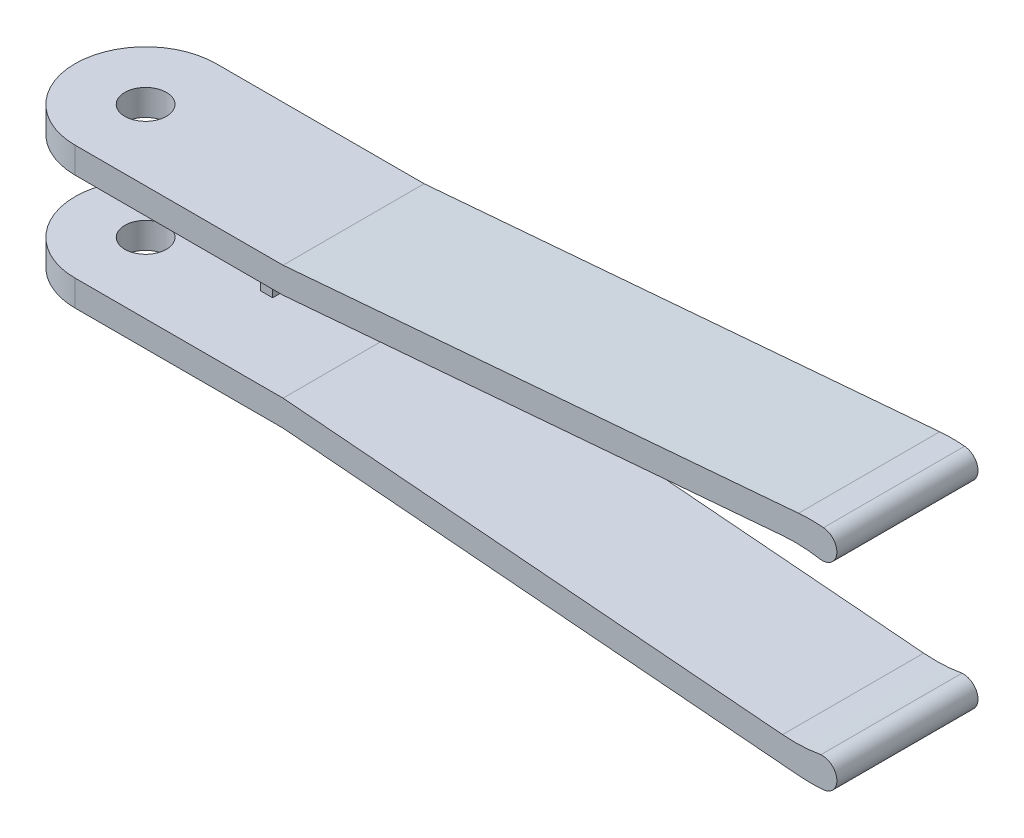
ISO-10303-21;
HEADER;
FILE_DESCRIPTION(('STEP AP214'),'2;1');
FILE_NAME('part.step','',(''),(''),'','','');
FILE_SCHEMA(('AUTOMOTIVE_DESIGN { 1 0 10303 214 1 1 1 1 }'));
ENDSEC;
DATA;
#1=APPLICATION_CONTEXT('core data for automotive mechanical design processes');
#2=APPLICATION_PROTOCOL_DEFINITION('international standard','automotive_design',2000,#1);
#3=PRODUCT_CONTEXT('',#1,'mechanical');
#4=PRODUCT('Part','Part','',(#3));
#5=PRODUCT_RELATED_PRODUCT_CATEGORY('part','',(#4));
#6=PRODUCT_DEFINITION_FORMATION('','',#4);
#7=PRODUCT_DEFINITION_CONTEXT('part definition',#1,'design');
#8=PRODUCT_DEFINITION('design','',#6,#7);
#9=PRODUCT_DEFINITION_SHAPE('','',#8);
#10=(LENGTH_UNIT() NAMED_UNIT(*) SI_UNIT(.MILLI.,.METRE.));
#11=(NAMED_UNIT(*) PLANE_ANGLE_UNIT() SI_UNIT($,.RADIAN.));
#12=(NAMED_UNIT(*) SI_UNIT($,.STERADIAN.) SOLID_ANGLE_UNIT());
#13=UNCERTAINTY_MEASURE_WITH_UNIT(LENGTH_MEASURE(1.E-05),#10,'distance_accuracy_value','');
#14=(GEOMETRIC_REPRESENTATION_CONTEXT(3) GLOBAL_UNCERTAINTY_ASSIGNED_CONTEXT((#13)) GLOBAL_UNIT_ASSIGNED_CONTEXT((#10,
#11,#12)) REPRESENTATION_CONTEXT('',''));
#15=CARTESIAN_POINT('',(0.,0.,0.));
#16=DIRECTION('',(0.,0.,1.));
#17=DIRECTION('',(1.,0.,0.));
#18=AXIS2_PLACEMENT_3D('',#15,#16,#17);
#19=CARTESIAN_POINT('',(0.,0.,0.));
#20=DIRECTION('',(0.,1.,0.));
#21=DIRECTION('',(0.,0.,1.));
#22=AXIS2_PLACEMENT_3D('',#19,#20,#21);
#23=PLANE('',#22);
#24=CARTESIAN_POINT('',(0.,0.,0.));
#25=DIRECTION('',(0.,1.,0.));
#26=DIRECTION('',(0.,0.,1.));
#27=AXIS2_PLACEMENT_3D('',#24,#25,#26);
#28=CIRCLE('',#27,1.4);
#29=CARTESIAN_POINT('',(0.,0.,1.4));
#30=VERTEX_POINT('',#29);
#31=EDGE_CURVE('E342',#30,#30,#28,.T.);
#32=ORIENTED_EDGE('',*,*,#31,.T.);
#33=EDGE_LOOP('',(#32));
#34=FACE_BOUND('',#33,.T.);
#35=DIRECTION('',(0.,0.,1.));
#36=VECTOR('',#35,1.);
#37=CARTESIAN_POINT('',(7.8,0.,-0.75));
#38=LINE('',#37,#36);
#39=CARTESIAN_POINT('',(7.8,0.,-4.75));
#40=VERTEX_POINT('',#39);
#41=CARTESIAN_POINT('',(7.8,0.,-0.75));
#42=VERTEX_POINT('',#41);
#43=EDGE_CURVE('E57',#40,#42,#38,.T.);
#44=ORIENTED_EDGE('',*,*,#43,.F.);
#45=DIRECTION('',(1.,0.,0.));
#46=VECTOR('',#45,1.);
#47=CARTESIAN_POINT('',(14.,0.,-4.75));
#48=LINE('',#47,#46);
#49=CARTESIAN_POINT('',(14.,0.,-4.75));
#50=VERTEX_POINT('',#49);
#51=EDGE_CURVE('E330',#40,#50,#48,.T.);
#52=ORIENTED_EDGE('',*,*,#51,.T.);
#53=DIRECTION('',(0.,0.,1.));
#54=VECTOR('',#53,1.);
#55=CARTESIAN_POINT('',(14.,0.,-4.75));
#56=LINE('',#55,#54);
#57=CARTESIAN_POINT('',(14.,0.,4.75));
#58=VERTEX_POINT('',#57);
#59=EDGE_CURVE('E338',#50,#58,#56,.T.);
#60=ORIENTED_EDGE('',*,*,#59,.T.);
#61=DIRECTION('',(1.,0.,0.));
#62=VECTOR('',#61,1.);
#63=CARTESIAN_POINT('',(14.,0.,4.75));
#64=LINE('',#63,#62);
#65=CARTESIAN_POINT('',(0.,0.,4.75));
#66=VERTEX_POINT('',#65);
#67=EDGE_CURVE('E317',#66,#58,#64,.T.);
#68=ORIENTED_EDGE('',*,*,#67,.F.);
#69=CARTESIAN_POINT('',(0.,0.,0.));
#70=DIRECTION('',(0.,1.,0.));
#71=DIRECTION('',(0.,0.,1.));
#72=AXIS2_PLACEMENT_3D('',#69,#70,#71);
#73=CIRCLE('',#72,4.75);
#74=CARTESIAN_POINT('',(0.,0.,-4.75));
#75=VERTEX_POINT('',#74);
#76=EDGE_CURVE('E347',#75,#66,#73,.T.);
#77=ORIENTED_EDGE('',*,*,#76,.F.);
#78=CARTESIAN_POINT('',(7.,0.,-4.75));
#79=VERTEX_POINT('',#78);
#80=EDGE_CURVE('E331',#75,#79,#48,.T.);
#81=ORIENTED_EDGE('',*,*,#80,.T.);
#82=DIRECTION('',(0.,0.,-1.));
#83=VECTOR('',#82,1.);
#84=CARTESIAN_POINT('',(7.,0.,-0.75));
#85=LINE('',#84,#83);
#86=CARTESIAN_POINT('',(7.,0.,-0.75));
#87=VERTEX_POINT('',#86);
#88=EDGE_CURVE('E290',#87,#79,#85,.T.);
#89=ORIENTED_EDGE('',*,*,#88,.F.);
#90=DIRECTION('',(-1.,0.,0.));
#91=VECTOR('',#90,1.);
#92=CARTESIAN_POINT('',(7.8,0.,-0.75));
#93=LINE('',#92,#91);
#94=EDGE_CURVE('E52',#42,#87,#93,.T.);
#95=ORIENTED_EDGE('',*,*,#94,.F.);
#96=EDGE_LOOP('',(#44,#52,#60,#68,#77,#81,#89,#95));
#97=FACE_BOUND('',#96,.T.);
#98=ADVANCED_FACE('F37',(#34,#97),#23,.F.);
#99=CARTESIAN_POINT('',(0.,0.,-4.75));
#100=DIRECTION('',(0.,0.,-1.));
#101=DIRECTION('',(-1.,0.,0.));
#102=AXIS2_PLACEMENT_3D('',#99,#100,#101);
#103=PLANE('',#102);
#104=CARTESIAN_POINT('',(50.2996742308016,3.66225042756846,-4.75));
#105=DIRECTION('',(0.,0.,-1.));
#106=DIRECTION('',(1.,0.,0.));
#107=AXIS2_PLACEMENT_3D('',#104,#105,#106);
#108=CIRCLE('',#107,0.981627756167204);
#109=CARTESIAN_POINT('',(50.383057366514,4.64033033450686,-4.75));
#110=VERTEX_POINT('',#109);
#111=CARTESIAN_POINT('',(50.150530668651,2.69201888327251,-4.75));
#112=VERTEX_POINT('',#111);
#113=EDGE_CURVE('E306',#110,#112,#108,.T.);
#114=ORIENTED_EDGE('',*,*,#113,.T.);
#115=DIRECTION('',(0.984609605148747,-0.174768204913905,0.));
#116=VECTOR('',#115,1.);
#117=CARTESIAN_POINT('',(1.99503251546959,11.2396198054623,-4.75));
#118=LINE('',#117,#116);
#119=CARTESIAN_POINT('',(50.2029815152426,2.68270885800252,-4.75));
#120=VERTEX_POINT('',#119);
#121=EDGE_CURVE('E298',#112,#120,#118,.T.);
#122=ORIENTED_EDGE('',*,*,#121,.T.);
#123=CARTESIAN_POINT('',(48.4552994661035,-7.16338719348495,-4.75));
#124=DIRECTION('',(0.,0.,-1.));
#125=DIRECTION('',(-1.,0.,0.));
#126=AXIS2_PLACEMENT_3D('',#123,#124,#125);
#127=CIRCLE('',#126,10.);
#128=CARTESIAN_POINT('',(47.6248446675661,2.80207038896384,-4.75));
#129=VERTEX_POINT('',#128);
#130=EDGE_CURVE('E11',#120,#129,#127,.F.);
#131=ORIENTED_EDGE('',*,*,#130,.T.);
#132=DIRECTION('',(0.99654575824488,0.08304547985374,0.));
#133=VECTOR('',#132,1.);
#134=CARTESIAN_POINT('',(14.,0.,-4.75));
#135=LINE('',#134,#133);
#136=EDGE_CURVE('E333',#50,#129,#135,.T.);
#137=ORIENTED_EDGE('',*,*,#136,.F.);
#138=ORIENTED_EDGE('',*,*,#51,.F.);
#139=DIRECTION('',(0.,1.,0.));
#140=VECTOR('',#139,1.);
#141=CARTESIAN_POINT('',(7.8,-3.,-4.75));
#142=LINE('',#141,#140);
#143=CARTESIAN_POINT('',(7.8,-6.,-4.75));
#144=VERTEX_POINT('',#143);
#145=EDGE_CURVE('E292',#144,#40,#142,.T.);
#146=ORIENTED_EDGE('',*,*,#145,.F.);
#147=DIRECTION('',(1.,0.,0.));
#148=VECTOR('',#147,1.);
#149=CARTESIAN_POINT('',(14.,-6.,-4.75));
#150=LINE('',#149,#148);
#151=CARTESIAN_POINT('',(14.,-6.,-4.75));
#152=VERTEX_POINT('',#151);
#153=EDGE_CURVE('E245',#144,#152,#150,.T.);
#154=ORIENTED_EDGE('',*,*,#153,.T.);
#155=DIRECTION('',(0.99654575824488,-0.08304547985374,0.));
#156=VECTOR('',#155,1.);
#157=CARTESIAN_POINT('',(14.,-6.,-4.75));
#158=LINE('',#157,#156);
#159=CARTESIAN_POINT('',(47.6248446675661,-8.80207038896384,-4.75));
#160=VERTEX_POINT('',#159);
#161=EDGE_CURVE('E248',#152,#160,#158,.T.);
#162=ORIENTED_EDGE('',*,*,#161,.T.);
#163=CARTESIAN_POINT('',(48.4552994661035,1.16338719348495,-4.75));
#164=DIRECTION('',(0.,0.,1.));
#165=DIRECTION('',(-1.,0.,0.));
#166=AXIS2_PLACEMENT_3D('',#163,#164,#165);
#167=CIRCLE('',#166,10.);
#168=CARTESIAN_POINT('',(50.2029815152426,-8.68270885800252,-4.75));
#169=VERTEX_POINT('',#168);
#170=EDGE_CURVE('E285',#169,#160,#167,.F.);
#171=ORIENTED_EDGE('',*,*,#170,.F.);
#172=DIRECTION('',(0.984609605148747,0.174768204913905,0.));
#173=VECTOR('',#172,1.);
#174=CARTESIAN_POINT('',(1.99503251546959,-17.2396198054623,-4.75));
#175=LINE('',#174,#173);
#176=CARTESIAN_POINT('',(50.150530668651,-8.69201888327251,-4.75));
#177=VERTEX_POINT('',#176);
#178=EDGE_CURVE('E211',#177,#169,#175,.T.);
#179=ORIENTED_EDGE('',*,*,#178,.F.);
#180=CARTESIAN_POINT('',(50.2996742308016,-9.66225042756846,-4.75));
#181=DIRECTION('',(0.,0.,1.));
#182=DIRECTION('',(1.,0.,0.));
#183=AXIS2_PLACEMENT_3D('',#180,#181,#182);
#184=CIRCLE('',#183,0.981627756167204);
#185=CARTESIAN_POINT('',(50.383057366514,-10.6403303345069,-4.75));
#186=VERTEX_POINT('',#185);
#187=EDGE_CURVE('E219',#186,#177,#184,.T.);
#188=ORIENTED_EDGE('',*,*,#187,.F.);
#189=CARTESIAN_POINT('',(49.5336199378298,-0.676472845825566,-4.75));
#190=DIRECTION('',(0.,0.,1.));
#191=DIRECTION('',(-1.,0.,0.));
#192=AXIS2_PLACEMENT_3D('',#189,#190,#191);
#193=CIRCLE('',#192,10.);
#194=CARTESIAN_POINT('',(48.7031651392924,-10.6419304282744,-4.75));
#195=VERTEX_POINT('',#194);
#196=EDGE_CURVE('E275',#195,#186,#193,.T.);
#197=ORIENTED_EDGE('',*,*,#196,.F.);
#198=DIRECTION('',(-0.99654575824488,0.08304547985374,0.));
#199=VECTOR('',#198,1.);
#200=CARTESIAN_POINT('',(14.,-7.75,-4.75));
#201=LINE('',#200,#199);
#202=CARTESIAN_POINT('',(14.,-7.75,-4.75));
#203=VERTEX_POINT('',#202);
#204=EDGE_CURVE('E251',#195,#203,#201,.T.);
#205=ORIENTED_EDGE('',*,*,#204,.T.);
#206=DIRECTION('',(-1.,0.,0.));
#207=VECTOR('',#206,1.);
#208=CARTESIAN_POINT('',(0.,-7.75,-4.75));
#209=LINE('',#208,#207);
#210=CARTESIAN_POINT('',(0.,-7.75,-4.75));
#211=VERTEX_POINT('',#210);
#212=EDGE_CURVE('E240',#203,#211,#209,.T.);
#213=ORIENTED_EDGE('',*,*,#212,.T.);
#214=DIRECTION('',(0.,1.,0.));
#215=VECTOR('',#214,1.);
#216=CARTESIAN_POINT('',(0.,-6.,-4.75));
#217=LINE('',#216,#215);
#218=CARTESIAN_POINT('',(0.,-6.,-4.75));
#219=VERTEX_POINT('',#218);
#220=EDGE_CURVE('E243',#211,#219,#217,.T.);
#221=ORIENTED_EDGE('',*,*,#220,.T.);
#222=CARTESIAN_POINT('',(7.,-6.,-4.75));
#223=VERTEX_POINT('',#222);
#224=EDGE_CURVE('E246',#219,#223,#150,.T.);
#225=ORIENTED_EDGE('',*,*,#224,.T.);
#226=DIRECTION('',(0.,1.,0.));
#227=VECTOR('',#226,1.);
#228=CARTESIAN_POINT('',(7.,-3.,-4.75));
#229=LINE('',#228,#227);
#230=EDGE_CURVE('E193',#223,#79,#229,.T.);
#231=ORIENTED_EDGE('',*,*,#230,.T.);
#232=ORIENTED_EDGE('',*,*,#80,.F.);
#233=DIRECTION('',(0.,-1.,0.));
#234=VECTOR('',#233,1.);
#235=CARTESIAN_POINT('',(0.,0.,-4.75));
#236=LINE('',#235,#234);
#237=CARTESIAN_POINT('',(0.,1.75,-4.75));
#238=VERTEX_POINT('',#237);
#239=EDGE_CURVE('E328',#238,#75,#236,.T.);
#240=ORIENTED_EDGE('',*,*,#239,.F.);
#241=DIRECTION('',(-1.,0.,0.));
#242=VECTOR('',#241,1.);
#243=CARTESIAN_POINT('',(0.,1.75,-4.75));
#244=LINE('',#243,#242);
#245=CARTESIAN_POINT('',(14.,1.75,-4.75));
#246=VERTEX_POINT('',#245);
#247=EDGE_CURVE('E325',#246,#238,#244,.T.);
#248=ORIENTED_EDGE('',*,*,#247,.F.);
#249=DIRECTION('',(-0.99654575824488,-0.08304547985374,0.));
#250=VECTOR('',#249,1.);
#251=CARTESIAN_POINT('',(14.,1.75,-4.75));
#252=LINE('',#251,#250);
#253=CARTESIAN_POINT('',(48.7031651392924,4.64193042827436,-4.75));
#254=VERTEX_POINT('',#253);
#255=EDGE_CURVE('E336',#254,#246,#252,.T.);
#256=ORIENTED_EDGE('',*,*,#255,.F.);
#257=CARTESIAN_POINT('',(49.5336199378298,-5.32352715417443,-4.75));
#258=DIRECTION('',(0.,0.,-1.));
#259=DIRECTION('',(-1.,0.,0.));
#260=AXIS2_PLACEMENT_3D('',#257,#258,#259);
#261=CIRCLE('',#260,10.);
#262=EDGE_CURVE('E358',#254,#110,#261,.T.);
#263=ORIENTED_EDGE('',*,*,#262,.T.);
#264=EDGE_LOOP('',(#114,#122,#131,#137,#138,#146,#154,#162,#171,#179,#188,#197,#205,#213,#221,
#225,#231,#232,#240,#248,#256,#263));
#265=FACE_BOUND('',#264,.T.);
#266=ADVANCED_FACE('F379',(#265),#103,.T.);
#267=CARTESIAN_POINT('',(0.,0.,4.75));
#268=DIRECTION('',(0.,0.,-1.));
#269=DIRECTION('',(-1.,0.,0.));
#270=AXIS2_PLACEMENT_3D('',#267,#268,#269);
#271=PLANE('',#270);
#272=DIRECTION('',(0.984609605148747,-0.174768204913905,0.));
#273=VECTOR('',#272,1.);
#274=CARTESIAN_POINT('',(1.99503251546959,11.2396198054623,4.75));
#275=LINE('',#274,#273);
#276=CARTESIAN_POINT('',(50.150530668651,2.69201888327251,4.75));
#277=VERTEX_POINT('',#276);
#278=CARTESIAN_POINT('',(50.2029815152426,2.68270885800252,4.75));
#279=VERTEX_POINT('',#278);
#280=EDGE_CURVE('E297',#277,#279,#275,.T.);
#281=ORIENTED_EDGE('',*,*,#280,.F.);
#282=CARTESIAN_POINT('',(50.2996742308016,3.66225042756846,4.75));
#283=DIRECTION('',(0.,0.,-1.));
#284=DIRECTION('',(1.,0.,0.));
#285=AXIS2_PLACEMENT_3D('',#282,#283,#284);
#286=CIRCLE('',#285,0.981627756167204);
#287=CARTESIAN_POINT('',(50.383057366514,4.64033033450686,4.75));
#288=VERTEX_POINT('',#287);
#289=EDGE_CURVE('E305',#288,#277,#286,.T.);
#290=ORIENTED_EDGE('',*,*,#289,.F.);
#291=CARTESIAN_POINT('',(49.5336199378298,-5.32352715417443,4.75));
#292=DIRECTION('',(0.,0.,-1.));
#293=DIRECTION('',(-1.,0.,0.));
#294=AXIS2_PLACEMENT_3D('',#291,#292,#293);
#295=CIRCLE('',#294,10.);
#296=CARTESIAN_POINT('',(48.7031651392924,4.64193042827436,4.75));
#297=VERTEX_POINT('',#296);
#298=EDGE_CURVE('E353',#288,#297,#295,.F.);
#299=ORIENTED_EDGE('',*,*,#298,.T.);
#300=DIRECTION('',(-0.99654575824488,-0.08304547985374,0.));
#301=VECTOR('',#300,1.);
#302=CARTESIAN_POINT('',(14.,1.75,4.75));
#303=LINE('',#302,#301);
#304=CARTESIAN_POINT('',(14.,1.75,4.75));
#305=VERTEX_POINT('',#304);
#306=EDGE_CURVE('E323',#297,#305,#303,.T.);
#307=ORIENTED_EDGE('',*,*,#306,.T.);
#308=DIRECTION('',(-1.,0.,0.));
#309=VECTOR('',#308,1.);
#310=CARTESIAN_POINT('',(0.,1.75,4.75));
#311=LINE('',#310,#309);
#312=CARTESIAN_POINT('',(0.,1.75,4.75));
#313=VERTEX_POINT('',#312);
#314=EDGE_CURVE('E311',#305,#313,#311,.T.);
#315=ORIENTED_EDGE('',*,*,#314,.T.);
#316=DIRECTION('',(0.,-1.,0.));
#317=VECTOR('',#316,1.);
#318=CARTESIAN_POINT('',(0.,0.,4.75));
#319=LINE('',#318,#317);
#320=EDGE_CURVE('E314',#313,#66,#319,.T.);
#321=ORIENTED_EDGE('',*,*,#320,.T.);
#322=ORIENTED_EDGE('',*,*,#67,.T.);
#323=DIRECTION('',(0.99654575824488,0.08304547985374,0.));
#324=VECTOR('',#323,1.);
#325=CARTESIAN_POINT('',(14.,0.,4.75));
#326=LINE('',#325,#324);
#327=CARTESIAN_POINT('',(47.6248446675661,2.80207038896384,4.75));
#328=VERTEX_POINT('',#327);
#329=EDGE_CURVE('E320',#58,#328,#326,.T.);
#330=ORIENTED_EDGE('',*,*,#329,.T.);
#331=CARTESIAN_POINT('',(48.4552994661035,-7.16338719348495,4.75));
#332=DIRECTION('',(0.,0.,-1.));
#333=DIRECTION('',(-1.,0.,0.));
#334=AXIS2_PLACEMENT_3D('',#331,#332,#333);
#335=CIRCLE('',#334,10.);
#336=EDGE_CURVE('E45',#328,#279,#335,.T.);
#337=ORIENTED_EDGE('',*,*,#336,.T.);
#338=EDGE_LOOP('',(#281,#290,#299,#307,#315,#321,#322,#330,#337));
#339=FACE_BOUND('',#338,.T.);
#340=ADVANCED_FACE('F369',(#339),#271,.F.);
#341=CARTESIAN_POINT('',(0.,1.75,0.));
#342=DIRECTION('',(0.,1.,0.));
#343=DIRECTION('',(0.,0.,1.));
#344=AXIS2_PLACEMENT_3D('',#341,#342,#343);
#345=PLANE('',#344);
#346=CARTESIAN_POINT('',(0.,1.75,0.));
#347=DIRECTION('',(0.,1.,0.));
#348=DIRECTION('',(0.,0.,1.));
#349=AXIS2_PLACEMENT_3D('',#346,#347,#348);
#350=CIRCLE('',#349,1.4);
#351=CARTESIAN_POINT('',(0.,1.75,1.4));
#352=VERTEX_POINT('',#351);
#353=EDGE_CURVE('E344',#352,#352,#350,.T.);
#354=ORIENTED_EDGE('',*,*,#353,.F.);
#355=EDGE_LOOP('',(#354));
#356=FACE_BOUND('',#355,.T.);
#357=ORIENTED_EDGE('',*,*,#247,.T.);
#358=CARTESIAN_POINT('',(0.,1.75,0.));
#359=DIRECTION('',(0.,1.,0.));
#360=DIRECTION('',(0.,0.,1.));
#361=AXIS2_PLACEMENT_3D('',#358,#359,#360);
#362=CIRCLE('',#361,4.75);
#363=EDGE_CURVE('E350',#238,#313,#362,.T.);
#364=ORIENTED_EDGE('',*,*,#363,.T.);
#365=ORIENTED_EDGE('',*,*,#314,.F.);
#366=DIRECTION('',(0.,0.,1.));
#367=VECTOR('',#366,1.);
#368=CARTESIAN_POINT('',(14.,1.75,-4.75));
#369=LINE('',#368,#367);
#370=EDGE_CURVE('E339',#246,#305,#369,.T.);
#371=ORIENTED_EDGE('',*,*,#370,.F.);
#372=EDGE_LOOP('',(#357,#364,#365,#371));
#373=FACE_BOUND('',#372,.T.);
#374=ADVANCED_FACE('F399',(#356,#373),#345,.T.);
#375=CARTESIAN_POINT('',(0.,1.75,0.));
#376=DIRECTION('',(0.,-1.,0.));
#377=DIRECTION('',(0.,0.,-1.));
#378=AXIS2_PLACEMENT_3D('',#375,#376,#377);
#379=CYLINDRICAL_SURFACE('',#378,4.75);
#380=ORIENTED_EDGE('',*,*,#363,.F.);
#381=ORIENTED_EDGE('',*,*,#239,.T.);
#382=ORIENTED_EDGE('',*,*,#76,.T.);
#383=ORIENTED_EDGE('',*,*,#320,.F.);
#384=EDGE_LOOP('',(#380,#381,#382,#383));
#385=FACE_BOUND('',#384,.T.);
#386=ADVANCED_FACE('F428',(#385),#379,.T.);
#387=CARTESIAN_POINT('',(0.,1.75,0.));
#388=DIRECTION('',(0.,-1.,0.));
#389=DIRECTION('',(0.,0.,-1.));
#390=AXIS2_PLACEMENT_3D('',#387,#388,#389);
#391=CYLINDRICAL_SURFACE('',#390,1.4);
#392=ORIENTED_EDGE('',*,*,#353,.T.);
#393=EDGE_LOOP('',(#392));
#394=FACE_BOUND('',#393,.T.);
#395=ORIENTED_EDGE('',*,*,#31,.F.);
#396=EDGE_LOOP('',(#395));
#397=FACE_BOUND('',#396,.T.);
#398=ADVANCED_FACE('F430',(#394,#397),#391,.F.);
#399=CARTESIAN_POINT('',(14.,1.75,-4.75));
#400=DIRECTION('',(-0.08304547985374,0.99654575824488,0.));
#401=DIRECTION('',(-0.99654575824488,-0.08304547985374,0.));
#402=AXIS2_PLACEMENT_3D('',#399,#400,#401);
#403=PLANE('',#402);
#404=ORIENTED_EDGE('',*,*,#306,.F.);
#405=DIRECTION('',(0.,0.,1.));
#406=VECTOR('',#405,1.);
#407=CARTESIAN_POINT('',(48.7031651392924,4.64193042827436,-4.75));
#408=LINE('',#407,#406);
#409=EDGE_CURVE('E356',#297,#254,#408,.F.);
#410=ORIENTED_EDGE('',*,*,#409,.T.);
#411=ORIENTED_EDGE('',*,*,#255,.T.);
#412=ORIENTED_EDGE('',*,*,#370,.T.);
#413=EDGE_LOOP('',(#404,#410,#411,#412));
#414=FACE_BOUND('',#413,.T.);
#415=ADVANCED_FACE('F393',(#414),#403,.T.);
#416=CARTESIAN_POINT('',(14.,0.,-4.75));
#417=DIRECTION('',(0.08304547985374,-0.99654575824488,0.));
#418=DIRECTION('',(0.99654575824488,0.08304547985374,0.));
#419=AXIS2_PLACEMENT_3D('',#416,#417,#418);
#420=PLANE('',#419);
#421=ORIENTED_EDGE('',*,*,#136,.T.);
#422=DIRECTION('',(0.,0.,1.));
#423=VECTOR('',#422,1.);
#424=CARTESIAN_POINT('',(47.6248446675661,2.80207038896384,4.75));
#425=LINE('',#424,#423);
#426=EDGE_CURVE('E361',#129,#328,#425,.T.);
#427=ORIENTED_EDGE('',*,*,#426,.T.);
#428=ORIENTED_EDGE('',*,*,#329,.F.);
#429=ORIENTED_EDGE('',*,*,#59,.F.);
#430=EDGE_LOOP('',(#421,#427,#428,#429));
#431=FACE_BOUND('',#430,.T.);
#432=ADVANCED_FACE('F406',(#431),#420,.T.);
#433=CARTESIAN_POINT('',(49.5336199378298,-5.32352715417443,-4.75));
#434=DIRECTION('',(0.,0.,1.));
#435=DIRECTION('',(1.,0.,0.));
#436=AXIS2_PLACEMENT_3D('',#433,#434,#435);
#437=CYLINDRICAL_SURFACE('',#436,10.);
#438=DIRECTION('',(0.,0.,1.));
#439=VECTOR('',#438,1.);
#440=CARTESIAN_POINT('',(50.383057366514,4.64033033450686,-4.75));
#441=LINE('',#440,#439);
#442=EDGE_CURVE('E308',#110,#288,#441,.T.);
#443=ORIENTED_EDGE('',*,*,#442,.F.);
#444=ORIENTED_EDGE('',*,*,#262,.F.);
#445=ORIENTED_EDGE('',*,*,#409,.F.);
#446=ORIENTED_EDGE('',*,*,#298,.F.);
#447=EDGE_LOOP('',(#443,#444,#445,#446));
#448=FACE_BOUND('',#447,.T.);
#449=ADVANCED_FACE('F391',(#448),#437,.T.);
#450=CARTESIAN_POINT('',(48.4552994661035,-7.16338719348495,-4.75));
#451=DIRECTION('',(0.,0.,-1.));
#452=DIRECTION('',(-1.,0.,0.));
#453=AXIS2_PLACEMENT_3D('',#450,#451,#452);
#454=CYLINDRICAL_SURFACE('',#453,10.);
#455=ORIENTED_EDGE('',*,*,#130,.F.);
#456=DIRECTION('',(0.,0.,1.));
#457=VECTOR('',#456,1.);
#458=CARTESIAN_POINT('',(50.2029815152425,2.68270885800252,-4.75));
#459=LINE('',#458,#457);
#460=EDGE_CURVE('E364',#279,#120,#459,.F.);
#461=ORIENTED_EDGE('',*,*,#460,.F.);
#462=ORIENTED_EDGE('',*,*,#336,.F.);
#463=ORIENTED_EDGE('',*,*,#426,.F.);
#464=EDGE_LOOP('',(#455,#461,#462,#463));
#465=FACE_BOUND('',#464,.T.);
#466=ADVANCED_FACE('F39',(#465),#454,.F.);
#467=CARTESIAN_POINT('',(50.2996742308016,3.66225042756846,-4.75));
#468=DIRECTION('',(0.,0.,1.));
#469=DIRECTION('',(1.,0.,0.));
#470=AXIS2_PLACEMENT_3D('',#467,#468,#469);
#471=CYLINDRICAL_SURFACE('',#470,0.981627756167204);
#472=ORIENTED_EDGE('',*,*,#289,.T.);
#473=DIRECTION('',(0.,0.,1.));
#474=VECTOR('',#473,1.);
#475=CARTESIAN_POINT('',(50.150530668651,2.69201888327251,-4.75));
#476=LINE('',#475,#474);
#477=EDGE_CURVE('E301',#112,#277,#476,.T.);
#478=ORIENTED_EDGE('',*,*,#477,.F.);
#479=ORIENTED_EDGE('',*,*,#113,.F.);
#480=ORIENTED_EDGE('',*,*,#442,.T.);
#481=EDGE_LOOP('',(#472,#478,#479,#480));
#482=FACE_BOUND('',#481,.T.);
#483=ADVANCED_FACE('F386',(#482),#471,.T.);
#484=CARTESIAN_POINT('',(1.99503251546959,11.2396198054623,-4.75));
#485=DIRECTION('',(-0.174768204913905,-0.984609605148747,0.));
#486=DIRECTION('',(0.984609605148747,-0.174768204913905,0.));
#487=AXIS2_PLACEMENT_3D('',#484,#485,#486);
#488=PLANE('',#487);
#489=ORIENTED_EDGE('',*,*,#121,.F.);
#490=ORIENTED_EDGE('',*,*,#477,.T.);
#491=ORIENTED_EDGE('',*,*,#280,.T.);
#492=ORIENTED_EDGE('',*,*,#460,.T.);
#493=EDGE_LOOP('',(#489,#490,#491,#492));
#494=FACE_BOUND('',#493,.T.);
#495=ADVANCED_FACE('F377',(#494),#488,.F.);
#496=CARTESIAN_POINT('',(7.8,-3.,-0.75));
#497=DIRECTION('',(-1.,0.,0.));
#498=DIRECTION('',(0.,0.,1.));
#499=AXIS2_PLACEMENT_3D('',#496,#497,#498);
#500=PLANE('',#499);
#501=ORIENTED_EDGE('',*,*,#43,.T.);
#502=DIRECTION('',(0.,1.,0.));
#503=VECTOR('',#502,1.);
#504=CARTESIAN_POINT('',(7.8,-3.,-0.75));
#505=LINE('',#504,#503);
#506=CARTESIAN_POINT('',(7.8,-6.,-0.75));
#507=VERTEX_POINT('',#506);
#508=EDGE_CURVE('E192',#507,#42,#505,.T.);
#509=ORIENTED_EDGE('',*,*,#508,.F.);
#510=DIRECTION('',(0.,0.,1.));
#511=VECTOR('',#510,1.);
#512=CARTESIAN_POINT('',(7.8,-6.,-0.75));
#513=LINE('',#512,#511);
#514=EDGE_CURVE('E207',#144,#507,#513,.T.);
#515=ORIENTED_EDGE('',*,*,#514,.F.);
#516=ORIENTED_EDGE('',*,*,#145,.T.);
#517=EDGE_LOOP('',(#501,#509,#515,#516));
#518=FACE_BOUND('',#517,.T.);
#519=ADVANCED_FACE('F409',(#518),#500,.F.);
#520=CARTESIAN_POINT('',(7.8,-3.,-0.75));
#521=DIRECTION('',(0.,0.,-1.));
#522=DIRECTION('',(-1.,0.,0.));
#523=AXIS2_PLACEMENT_3D('',#520,#521,#522);
#524=PLANE('',#523);
#525=ORIENTED_EDGE('',*,*,#94,.T.);
#526=DIRECTION('',(0.,1.,0.));
#527=VECTOR('',#526,1.);
#528=CARTESIAN_POINT('',(7.,-3.,-0.75));
#529=LINE('',#528,#527);
#530=CARTESIAN_POINT('',(7.,-6.,-0.75));
#531=VERTEX_POINT('',#530);
#532=EDGE_CURVE('E184',#531,#87,#529,.T.);
#533=ORIENTED_EDGE('',*,*,#532,.F.);
#534=DIRECTION('',(-1.,0.,0.));
#535=VECTOR('',#534,1.);
#536=CARTESIAN_POINT('',(7.8,-6.,-0.75));
#537=LINE('',#536,#535);
#538=EDGE_CURVE('E188',#507,#531,#537,.T.);
#539=ORIENTED_EDGE('',*,*,#538,.F.);
#540=ORIENTED_EDGE('',*,*,#508,.T.);
#541=EDGE_LOOP('',(#525,#533,#539,#540));
#542=FACE_BOUND('',#541,.T.);
#543=ADVANCED_FACE('F186',(#542),#524,.F.);
#544=CARTESIAN_POINT('',(7.,-3.,-0.75));
#545=DIRECTION('',(1.,0.,0.));
#546=DIRECTION('',(0.,0.,-1.));
#547=AXIS2_PLACEMENT_3D('',#544,#545,#546);
#548=PLANE('',#547);
#549=ORIENTED_EDGE('',*,*,#88,.T.);
#550=ORIENTED_EDGE('',*,*,#230,.F.);
#551=DIRECTION('',(0.,0.,-1.));
#552=VECTOR('',#551,1.);
#553=CARTESIAN_POINT('',(7.,-6.,-0.75));
#554=LINE('',#553,#552);
#555=EDGE_CURVE('E196',#531,#223,#554,.T.);
#556=ORIENTED_EDGE('',*,*,#555,.F.);
#557=ORIENTED_EDGE('',*,*,#532,.T.);
#558=EDGE_LOOP('',(#549,#550,#556,#557));
#559=FACE_BOUND('',#558,.T.);
#560=ADVANCED_FACE('F197',(#559),#548,.F.);
#561=CARTESIAN_POINT('',(0.,-6.,0.));
#562=DIRECTION('',(0.,-1.,0.));
#563=DIRECTION('',(0.,0.,1.));
#564=AXIS2_PLACEMENT_3D('',#561,#562,#563);
#565=PLANE('',#564);
#566=CARTESIAN_POINT('',(0.,-6.,0.));
#567=DIRECTION('',(0.,1.,0.));
#568=DIRECTION('',(0.,0.,1.));
#569=AXIS2_PLACEMENT_3D('',#566,#567,#568);
#570=CIRCLE('',#569,1.4);
#571=CARTESIAN_POINT('',(0.,-6.,1.4));
#572=VERTEX_POINT('',#571);
#573=EDGE_CURVE('E257',#572,#572,#570,.T.);
#574=ORIENTED_EDGE('',*,*,#573,.F.);
#575=EDGE_LOOP('',(#574));
#576=FACE_BOUND('',#575,.T.);
#577=ORIENTED_EDGE('',*,*,#514,.T.);
#578=ORIENTED_EDGE('',*,*,#538,.T.);
#579=ORIENTED_EDGE('',*,*,#555,.T.);
#580=ORIENTED_EDGE('',*,*,#224,.F.);
#581=CARTESIAN_POINT('',(0.,-6.,0.));
#582=DIRECTION('',(0.,1.,0.));
#583=DIRECTION('',(0.,0.,1.));
#584=AXIS2_PLACEMENT_3D('',#581,#582,#583);
#585=CIRCLE('',#584,4.75);
#586=CARTESIAN_POINT('',(0.,-6.,4.75));
#587=VERTEX_POINT('',#586);
#588=EDGE_CURVE('E263',#219,#587,#585,.T.);
#589=ORIENTED_EDGE('',*,*,#588,.T.);
#590=DIRECTION('',(1.,0.,0.));
#591=VECTOR('',#590,1.);
#592=CARTESIAN_POINT('',(14.,-6.,4.75));
#593=LINE('',#592,#591);
#594=CARTESIAN_POINT('',(14.,-6.,4.75));
#595=VERTEX_POINT('',#594);
#596=EDGE_CURVE('E231',#587,#595,#593,.T.);
#597=ORIENTED_EDGE('',*,*,#596,.T.);
#598=DIRECTION('',(0.,0.,1.));
#599=VECTOR('',#598,1.);
#600=CARTESIAN_POINT('',(14.,-6.,-4.75));
#601=LINE('',#600,#599);
#602=EDGE_CURVE('E254',#152,#595,#601,.T.);
#603=ORIENTED_EDGE('',*,*,#602,.F.);
#604=ORIENTED_EDGE('',*,*,#153,.F.);
#605=EDGE_LOOP('',(#577,#578,#579,#580,#589,#597,#603,#604));
#606=FACE_BOUND('',#605,.T.);
#607=ADVANCED_FACE('F204',(#576,#606),#565,.F.);
#608=CARTESIAN_POINT('',(0.,-6.,4.75));
#609=DIRECTION('',(0.,0.,-1.));
#610=DIRECTION('',(-1.,0.,0.));
#611=AXIS2_PLACEMENT_3D('',#608,#609,#610);
#612=PLANE('',#611);
#613=DIRECTION('',(0.984609605148747,0.174768204913905,0.));
#614=VECTOR('',#613,1.);
#615=CARTESIAN_POINT('',(1.99503251546959,-17.2396198054623,4.75));
#616=LINE('',#615,#614);
#617=CARTESIAN_POINT('',(50.150530668651,-8.69201888327251,4.75));
#618=VERTEX_POINT('',#617);
#619=CARTESIAN_POINT('',(50.2029815152426,-8.68270885800252,4.75));
#620=VERTEX_POINT('',#619);
#621=EDGE_CURVE('E202',#618,#620,#616,.T.);
#622=ORIENTED_EDGE('',*,*,#621,.T.);
#623=CARTESIAN_POINT('',(48.4552994661035,1.16338719348495,4.75));
#624=DIRECTION('',(0.,0.,1.));
#625=DIRECTION('',(-1.,0.,0.));
#626=AXIS2_PLACEMENT_3D('',#623,#624,#625);
#627=CIRCLE('',#626,10.);
#628=CARTESIAN_POINT('',(47.6248446675661,-8.80207038896384,4.75));
#629=VERTEX_POINT('',#628);
#630=EDGE_CURVE('E282',#629,#620,#627,.T.);
#631=ORIENTED_EDGE('',*,*,#630,.F.);
#632=DIRECTION('',(0.99654575824488,-0.08304547985374,0.));
#633=VECTOR('',#632,1.);
#634=CARTESIAN_POINT('',(14.,-6.,4.75));
#635=LINE('',#634,#633);
#636=EDGE_CURVE('E234',#595,#629,#635,.T.);
#637=ORIENTED_EDGE('',*,*,#636,.F.);
#638=ORIENTED_EDGE('',*,*,#596,.F.);
#639=DIRECTION('',(0.,1.,0.));
#640=VECTOR('',#639,1.);
#641=CARTESIAN_POINT('',(0.,-6.,4.75));
#642=LINE('',#641,#640);
#643=CARTESIAN_POINT('',(0.,-7.75,4.75));
#644=VERTEX_POINT('',#643);
#645=EDGE_CURVE('E229',#644,#587,#642,.T.);
#646=ORIENTED_EDGE('',*,*,#645,.F.);
#647=DIRECTION('',(-1.,0.,0.));
#648=VECTOR('',#647,1.);
#649=CARTESIAN_POINT('',(0.,-7.75,4.75));
#650=LINE('',#649,#648);
#651=CARTESIAN_POINT('',(14.,-7.75,4.75));
#652=VERTEX_POINT('',#651);
#653=EDGE_CURVE('E226',#652,#644,#650,.T.);
#654=ORIENTED_EDGE('',*,*,#653,.F.);
#655=DIRECTION('',(-0.99654575824488,0.08304547985374,0.));
#656=VECTOR('',#655,1.);
#657=CARTESIAN_POINT('',(14.,-7.75,4.75));
#658=LINE('',#657,#656);
#659=CARTESIAN_POINT('',(48.7031651392924,-10.6419304282744,4.75));
#660=VERTEX_POINT('',#659);
#661=EDGE_CURVE('E237',#660,#652,#658,.T.);
#662=ORIENTED_EDGE('',*,*,#661,.F.);
#663=CARTESIAN_POINT('',(49.5336199378298,-0.676472845825566,4.75));
#664=DIRECTION('',(0.,0.,1.));
#665=DIRECTION('',(-1.,0.,0.));
#666=AXIS2_PLACEMENT_3D('',#663,#664,#665);
#667=CIRCLE('',#666,10.);
#668=CARTESIAN_POINT('',(50.383057366514,-10.6403303345069,4.75));
#669=VERTEX_POINT('',#668);
#670=EDGE_CURVE('E268',#669,#660,#667,.F.);
#671=ORIENTED_EDGE('',*,*,#670,.F.);
#672=CARTESIAN_POINT('',(50.2996742308016,-9.66225042756846,4.75));
#673=DIRECTION('',(0.,0.,1.));
#674=DIRECTION('',(1.,0.,0.));
#675=AXIS2_PLACEMENT_3D('',#672,#673,#674);
#676=CIRCLE('',#675,0.981627756167204);
#677=EDGE_CURVE('E218',#669,#618,#676,.T.);
#678=ORIENTED_EDGE('',*,*,#677,.T.);
#679=EDGE_LOOP('',(#622,#631,#637,#638,#646,#654,#662,#671,#678));
#680=FACE_BOUND('',#679,.T.);
#681=ADVANCED_FACE('F488',(#680),#612,.F.);
#682=CARTESIAN_POINT('',(0.,-7.75,0.));
#683=DIRECTION('',(0.,-1.,0.));
#684=DIRECTION('',(0.,0.,1.));
#685=AXIS2_PLACEMENT_3D('',#682,#683,#684);
#686=PLANE('',#685);
#687=CARTESIAN_POINT('',(0.,-7.75,0.));
#688=DIRECTION('',(0.,1.,0.));
#689=DIRECTION('',(0.,0.,1.));
#690=AXIS2_PLACEMENT_3D('',#687,#688,#689);
#691=CIRCLE('',#690,1.4);
#692=CARTESIAN_POINT('',(0.,-7.75,1.4));
#693=VERTEX_POINT('',#692);
#694=EDGE_CURVE('E260',#693,#693,#691,.T.);
#695=ORIENTED_EDGE('',*,*,#694,.T.);
#696=EDGE_LOOP('',(#695));
#697=FACE_BOUND('',#696,.T.);
#698=ORIENTED_EDGE('',*,*,#212,.F.);
#699=DIRECTION('',(0.,0.,1.));
#700=VECTOR('',#699,1.);
#701=CARTESIAN_POINT('',(14.,-7.75,-4.75));
#702=LINE('',#701,#700);
#703=EDGE_CURVE('E255',#203,#652,#702,.T.);
#704=ORIENTED_EDGE('',*,*,#703,.T.);
#705=ORIENTED_EDGE('',*,*,#653,.T.);
#706=CARTESIAN_POINT('',(0.,-7.75,0.));
#707=DIRECTION('',(0.,1.,0.));
#708=DIRECTION('',(0.,0.,1.));
#709=AXIS2_PLACEMENT_3D('',#706,#707,#708);
#710=CIRCLE('',#709,4.75);
#711=EDGE_CURVE('E266',#211,#644,#710,.T.);
#712=ORIENTED_EDGE('',*,*,#711,.F.);
#713=EDGE_LOOP('',(#698,#704,#705,#712));
#714=FACE_BOUND('',#713,.T.);
#715=ADVANCED_FACE('F499',(#697,#714),#686,.T.);
#716=CARTESIAN_POINT('',(0.,-7.75,0.));
#717=DIRECTION('',(0.,1.,0.));
#718=DIRECTION('',(0.,0.,-1.));
#719=AXIS2_PLACEMENT_3D('',#716,#717,#718);
#720=CYLINDRICAL_SURFACE('',#719,4.75);
#721=ORIENTED_EDGE('',*,*,#711,.T.);
#722=ORIENTED_EDGE('',*,*,#645,.T.);
#723=ORIENTED_EDGE('',*,*,#588,.F.);
#724=ORIENTED_EDGE('',*,*,#220,.F.);
#725=EDGE_LOOP('',(#721,#722,#723,#724));
#726=FACE_BOUND('',#725,.T.);
#727=ADVANCED_FACE('F509',(#726),#720,.T.);
#728=CARTESIAN_POINT('',(0.,-7.75,0.));
#729=DIRECTION('',(0.,1.,0.));
#730=DIRECTION('',(0.,0.,-1.));
#731=AXIS2_PLACEMENT_3D('',#728,#729,#730);
#732=CYLINDRICAL_SURFACE('',#731,1.4);
#733=ORIENTED_EDGE('',*,*,#694,.F.);
#734=EDGE_LOOP('',(#733));
#735=FACE_BOUND('',#734,.T.);
#736=ORIENTED_EDGE('',*,*,#573,.T.);
#737=EDGE_LOOP('',(#736));
#738=FACE_BOUND('',#737,.T.);
#739=ADVANCED_FACE('F519',(#735,#738),#732,.F.);
#740=CARTESIAN_POINT('',(14.,-7.75,-4.75));
#741=DIRECTION('',(-0.08304547985374,-0.99654575824488,0.));
#742=DIRECTION('',(-0.99654575824488,0.08304547985374,0.));
#743=AXIS2_PLACEMENT_3D('',#740,#741,#742);
#744=PLANE('',#743);
#745=ORIENTED_EDGE('',*,*,#661,.T.);
#746=ORIENTED_EDGE('',*,*,#703,.F.);
#747=ORIENTED_EDGE('',*,*,#204,.F.);
#748=DIRECTION('',(0.,0.,1.));
#749=VECTOR('',#748,1.);
#750=CARTESIAN_POINT('',(48.7031651392924,-10.6419304282744,-4.75));
#751=LINE('',#750,#749);
#752=EDGE_CURVE('E273',#660,#195,#751,.F.);
#753=ORIENTED_EDGE('',*,*,#752,.F.);
#754=EDGE_LOOP('',(#745,#746,#747,#753));
#755=FACE_BOUND('',#754,.T.);
#756=ADVANCED_FACE('F529',(#755),#744,.T.);
#757=CARTESIAN_POINT('',(14.,-6.,-4.75));
#758=DIRECTION('',(0.08304547985374,0.99654575824488,0.));
#759=DIRECTION('',(0.99654575824488,-0.08304547985374,0.));
#760=AXIS2_PLACEMENT_3D('',#757,#758,#759);
#761=PLANE('',#760);
#762=ORIENTED_EDGE('',*,*,#161,.F.);
#763=ORIENTED_EDGE('',*,*,#602,.T.);
#764=ORIENTED_EDGE('',*,*,#636,.T.);
#765=DIRECTION('',(0.,0.,1.));
#766=VECTOR('',#765,1.);
#767=CARTESIAN_POINT('',(47.6248446675661,-8.80207038896384,4.75));
#768=LINE('',#767,#766);
#769=EDGE_CURVE('E278',#160,#629,#768,.T.);
#770=ORIENTED_EDGE('',*,*,#769,.F.);
#771=EDGE_LOOP('',(#762,#763,#764,#770));
#772=FACE_BOUND('',#771,.T.);
#773=ADVANCED_FACE('F539',(#772),#761,.T.);
#774=CARTESIAN_POINT('',(49.5336199378298,-0.676472845825566,-4.75));
#775=DIRECTION('',(0.,0.,1.));
#776=DIRECTION('',(1.,0.,0.));
#777=AXIS2_PLACEMENT_3D('',#774,#775,#776);
#778=CYLINDRICAL_SURFACE('',#777,10.);
#779=DIRECTION('',(0.,0.,1.));
#780=VECTOR('',#779,1.);
#781=CARTESIAN_POINT('',(50.383057366514,-10.6403303345069,-4.75));
#782=LINE('',#781,#780);
#783=EDGE_CURVE('E222',#186,#669,#782,.T.);
#784=ORIENTED_EDGE('',*,*,#783,.T.);
#785=ORIENTED_EDGE('',*,*,#670,.T.);
#786=ORIENTED_EDGE('',*,*,#752,.T.);
#787=ORIENTED_EDGE('',*,*,#196,.T.);
#788=EDGE_LOOP('',(#784,#785,#786,#787));
#789=FACE_BOUND('',#788,.T.);
#790=ADVANCED_FACE('F549',(#789),#778,.T.);
#791=CARTESIAN_POINT('',(48.4552994661035,1.16338719348495,-4.75));
#792=DIRECTION('',(0.,0.,-1.));
#793=DIRECTION('',(-1.,0.,0.));
#794=AXIS2_PLACEMENT_3D('',#791,#792,#793);
#795=CYLINDRICAL_SURFACE('',#794,10.);
#796=ORIENTED_EDGE('',*,*,#170,.T.);
#797=ORIENTED_EDGE('',*,*,#769,.T.);
#798=ORIENTED_EDGE('',*,*,#630,.T.);
#799=DIRECTION('',(0.,0.,1.));
#800=VECTOR('',#799,1.);
#801=CARTESIAN_POINT('',(50.2029815152425,-8.68270885800252,-4.75));
#802=LINE('',#801,#800);
#803=EDGE_CURVE('E280',#620,#169,#802,.F.);
#804=ORIENTED_EDGE('',*,*,#803,.T.);
#805=EDGE_LOOP('',(#796,#797,#798,#804));
#806=FACE_BOUND('',#805,.T.);
#807=ADVANCED_FACE('F559',(#806),#795,.F.);
#808=CARTESIAN_POINT('',(50.2996742308016,-9.66225042756846,-4.75));
#809=DIRECTION('',(0.,0.,1.));
#810=DIRECTION('',(1.,0.,0.));
#811=AXIS2_PLACEMENT_3D('',#808,#809,#810);
#812=CYLINDRICAL_SURFACE('',#811,0.981627756167204);
#813=ORIENTED_EDGE('',*,*,#677,.F.);
#814=ORIENTED_EDGE('',*,*,#783,.F.);
#815=ORIENTED_EDGE('',*,*,#187,.T.);
#816=DIRECTION('',(0.,0.,1.));
#817=VECTOR('',#816,1.);
#818=CARTESIAN_POINT('',(50.150530668651,-8.69201888327251,-4.75));
#819=LINE('',#818,#817);
#820=EDGE_CURVE('E214',#177,#618,#819,.T.);
#821=ORIENTED_EDGE('',*,*,#820,.T.);
#822=EDGE_LOOP('',(#813,#814,#815,#821));
#823=FACE_BOUND('',#822,.T.);
#824=ADVANCED_FACE('F569',(#823),#812,.T.);
#825=CARTESIAN_POINT('',(1.99503251546959,-17.2396198054623,-4.75));
#826=DIRECTION('',(-0.174768204913905,0.984609605148747,0.));
#827=DIRECTION('',(0.984609605148747,0.174768204913905,0.));
#828=AXIS2_PLACEMENT_3D('',#825,#826,#827);
#829=PLANE('',#828);
#830=ORIENTED_EDGE('',*,*,#178,.T.);
#831=ORIENTED_EDGE('',*,*,#803,.F.);
#832=ORIENTED_EDGE('',*,*,#621,.F.);
#833=ORIENTED_EDGE('',*,*,#820,.F.);
#834=EDGE_LOOP('',(#830,#831,#832,#833));
#835=FACE_BOUND('',#834,.T.);
#836=ADVANCED_FACE('F579',(#835),#829,.F.);
#837=CLOSED_SHELL('',(#98,#266,#340,#374,#386,#398,#415,#432,#449,#466,#483,#495,#519,#543,#560,
#607,#681,#715,#727,#739,#756,#773,#790,#807,#824,#836));
#838=MANIFOLD_SOLID_BREP('B2',#837);
#839=ADVANCED_BREP_SHAPE_REPRESENTATION('',(#18,#838),#14);
#840=SHAPE_DEFINITION_REPRESENTATION(#9,#839);
ENDSEC;
END-ISO-10303-21;
